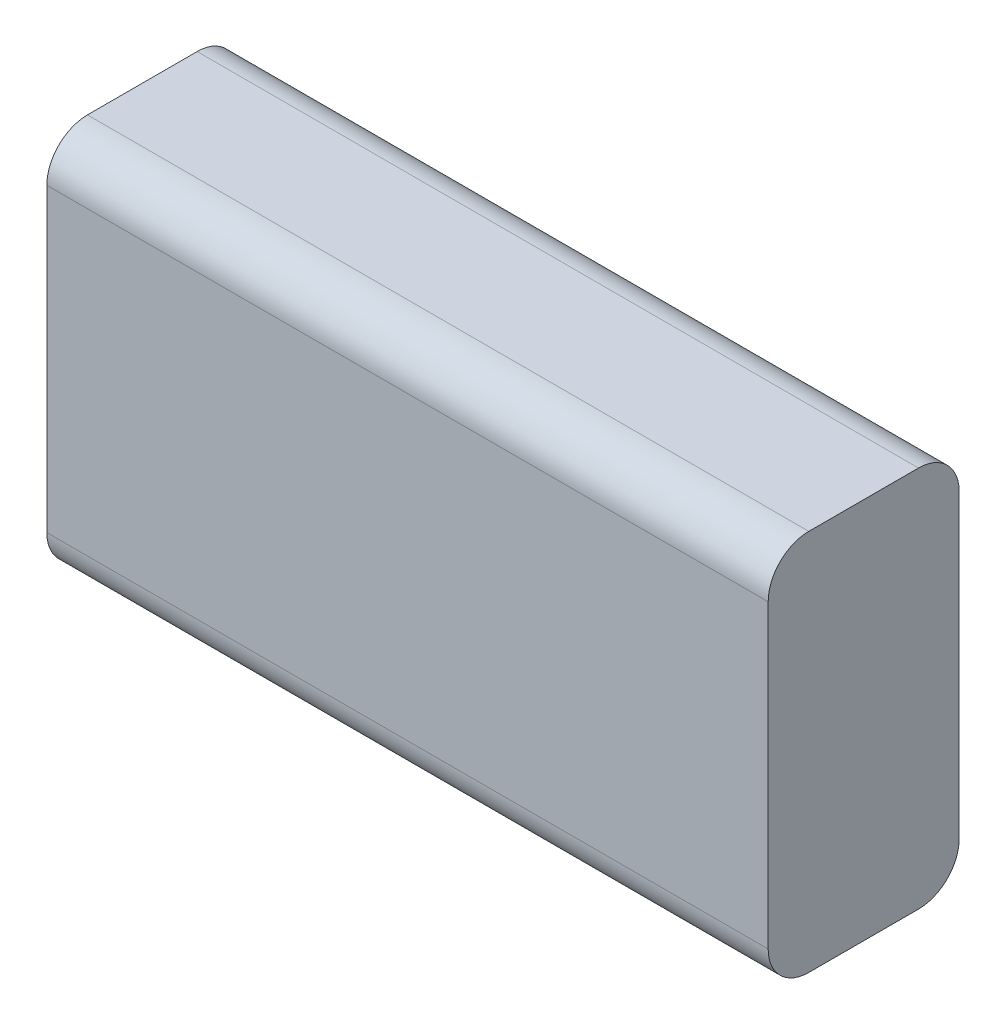
ISO-10303-21;
HEADER;
FILE_DESCRIPTION(('STEP AP214'),'2;1');
FILE_NAME('part.step','',(''),(''),'','','');
FILE_SCHEMA(('AUTOMOTIVE_DESIGN { 1 0 10303 214 1 1 1 1 }'));
ENDSEC;
DATA;
#1=APPLICATION_CONTEXT('core data for automotive mechanical design processes');
#2=APPLICATION_PROTOCOL_DEFINITION('international standard','automotive_design',2000,#1);
#3=PRODUCT_CONTEXT('',#1,'mechanical');
#4=PRODUCT('Part','Part','',(#3));
#5=PRODUCT_RELATED_PRODUCT_CATEGORY('part','',(#4));
#6=PRODUCT_DEFINITION_FORMATION('','',#4);
#7=PRODUCT_DEFINITION_CONTEXT('part definition',#1,'design');
#8=PRODUCT_DEFINITION('design','',#6,#7);
#9=PRODUCT_DEFINITION_SHAPE('','',#8);
#10=(LENGTH_UNIT() NAMED_UNIT(*) SI_UNIT(.MILLI.,.METRE.));
#11=(NAMED_UNIT(*) PLANE_ANGLE_UNIT() SI_UNIT($,.RADIAN.));
#12=(NAMED_UNIT(*) SI_UNIT($,.STERADIAN.) SOLID_ANGLE_UNIT());
#13=UNCERTAINTY_MEASURE_WITH_UNIT(LENGTH_MEASURE(1.E-05),#10,'distance_accuracy_value','');
#14=(GEOMETRIC_REPRESENTATION_CONTEXT(3) GLOBAL_UNCERTAINTY_ASSIGNED_CONTEXT((#13)) GLOBAL_UNIT_ASSIGNED_CONTEXT((#10,
#11,#12)) REPRESENTATION_CONTEXT('',''));
#15=CARTESIAN_POINT('',(0.,0.,0.));
#16=DIRECTION('',(0.,0.,1.));
#17=DIRECTION('',(1.,0.,0.));
#18=AXIS2_PLACEMENT_3D('',#15,#16,#17);
#19=CARTESIAN_POINT('',(27.9469853010806,-20.2775239107332,18.8));
#20=DIRECTION('',(-1.,0.,0.));
#21=DIRECTION('',(0.,0.,1.));
#22=AXIS2_PLACEMENT_3D('',#19,#20,#21);
#23=PLANE('',#22);
#24=DIRECTION('',(0.,0.,-1.));
#25=VECTOR('',#24,1.);
#26=CARTESIAN_POINT('',(27.9469853010806,-20.2775239107332,18.8));
#27=LINE('',#26,#25);
#28=CARTESIAN_POINT('',(27.9469853010806,-20.2775239107332,14.8));
#29=VERTEX_POINT('',#28);
#30=CARTESIAN_POINT('',(27.9469853010806,-20.2775239107332,4.));
#31=VERTEX_POINT('',#30);
#32=EDGE_CURVE('E150',#29,#31,#27,.T.);
#33=ORIENTED_EDGE('',*,*,#32,.T.);
#34=CARTESIAN_POINT('',(27.9469853010806,-16.2775239107332,4.));
#35=DIRECTION('',(-1.,0.,0.));
#36=DIRECTION('',(0.,0.,1.));
#37=AXIS2_PLACEMENT_3D('',#34,#35,#36);
#38=CIRCLE('',#37,4.);
#39=CARTESIAN_POINT('',(27.9469853010806,-16.2775239107332,0.));
#40=VERTEX_POINT('',#39);
#41=EDGE_CURVE('E52',#31,#40,#38,.F.);
#42=ORIENTED_EDGE('',*,*,#41,.T.);
#43=DIRECTION('',(0.,1.,0.));
#44=VECTOR('',#43,1.);
#45=CARTESIAN_POINT('',(27.9469853010806,-20.2775239107332,0.));
#46=LINE('',#45,#44);
#47=CARTESIAN_POINT('',(27.9469853010806,13.3224760892668,0.));
#48=VERTEX_POINT('',#47);
#49=EDGE_CURVE('E173',#40,#48,#46,.T.);
#50=ORIENTED_EDGE('',*,*,#49,.T.);
#51=CARTESIAN_POINT('',(27.9469853010806,13.3224760892668,4.));
#52=DIRECTION('',(-1.,0.,0.));
#53=DIRECTION('',(0.,0.,1.));
#54=AXIS2_PLACEMENT_3D('',#51,#52,#53);
#55=CIRCLE('',#54,4.);
#56=CARTESIAN_POINT('',(27.9469853010806,17.3224760892668,4.));
#57=VERTEX_POINT('',#56);
#58=EDGE_CURVE('E126',#48,#57,#55,.F.);
#59=ORIENTED_EDGE('',*,*,#58,.T.);
#60=DIRECTION('',(0.,0.,-1.));
#61=VECTOR('',#60,1.);
#62=CARTESIAN_POINT('',(27.9469853010806,17.3224760892668,18.8));
#63=LINE('',#62,#61);
#64=CARTESIAN_POINT('',(27.9469853010806,17.3224760892668,14.8));
#65=VERTEX_POINT('',#64);
#66=EDGE_CURVE('E111',#65,#57,#63,.T.);
#67=ORIENTED_EDGE('',*,*,#66,.F.);
#68=CARTESIAN_POINT('',(27.9469853010806,13.3224760892668,14.8));
#69=DIRECTION('',(-1.,0.,0.));
#70=DIRECTION('',(0.,0.,1.));
#71=AXIS2_PLACEMENT_3D('',#68,#69,#70);
#72=CIRCLE('',#71,4.);
#73=CARTESIAN_POINT('',(27.9469853010806,13.3224760892668,18.8));
#74=VERTEX_POINT('',#73);
#75=EDGE_CURVE('E109',#65,#74,#72,.F.);
#76=ORIENTED_EDGE('',*,*,#75,.T.);
#77=DIRECTION('',(0.,1.,0.));
#78=VECTOR('',#77,1.);
#79=CARTESIAN_POINT('',(27.9469853010806,-20.2775239107332,18.8));
#80=LINE('',#79,#78);
#81=CARTESIAN_POINT('',(27.9469853010806,-16.2775239107332,18.8));
#82=VERTEX_POINT('',#81);
#83=EDGE_CURVE('E95',#82,#74,#80,.T.);
#84=ORIENTED_EDGE('',*,*,#83,.F.);
#85=CARTESIAN_POINT('',(27.9469853010806,-16.2775239107332,14.8));
#86=DIRECTION('',(-1.,0.,0.));
#87=DIRECTION('',(0.,0.,1.));
#88=AXIS2_PLACEMENT_3D('',#85,#86,#87);
#89=CIRCLE('',#88,4.);
#90=EDGE_CURVE('E128',#82,#29,#89,.F.);
#91=ORIENTED_EDGE('',*,*,#90,.T.);
#92=EDGE_LOOP('',(#33,#42,#50,#59,#67,#76,#84,#91));
#93=FACE_BOUND('',#92,.T.);
#94=ADVANCED_FACE('F30',(#93),#23,.F.);
#95=CARTESIAN_POINT('',(27.9469853010806,17.3224760892668,18.8));
#96=DIRECTION('',(0.,-1.,0.));
#97=DIRECTION('',(1.,0.,0.));
#98=AXIS2_PLACEMENT_3D('',#95,#96,#97);
#99=PLANE('',#98);
#100=ORIENTED_EDGE('',*,*,#66,.T.);
#101=DIRECTION('',(-1.,0.,0.));
#102=VECTOR('',#101,1.);
#103=CARTESIAN_POINT('',(27.9469853010806,17.3224760892668,4.));
#104=LINE('',#103,#102);
#105=CARTESIAN_POINT('',(-43.0530146989194,17.3224760892668,4.));
#106=VERTEX_POINT('',#105);
#107=EDGE_CURVE('E136',#57,#106,#104,.T.);
#108=ORIENTED_EDGE('',*,*,#107,.T.);
#109=DIRECTION('',(0.,0.,-1.));
#110=VECTOR('',#109,1.);
#111=CARTESIAN_POINT('',(-43.0530146989194,17.3224760892668,18.8));
#112=LINE('',#111,#110);
#113=CARTESIAN_POINT('',(-43.0530146989194,17.3224760892668,14.8));
#114=VERTEX_POINT('',#113);
#115=EDGE_CURVE('E120',#114,#106,#112,.T.);
#116=ORIENTED_EDGE('',*,*,#115,.F.);
#117=DIRECTION('',(-1.,0.,0.));
#118=VECTOR('',#117,1.);
#119=CARTESIAN_POINT('',(27.9469853010806,17.3224760892668,14.8));
#120=LINE('',#119,#118);
#121=EDGE_CURVE('E114',#114,#65,#120,.F.);
#122=ORIENTED_EDGE('',*,*,#121,.T.);
#123=EDGE_LOOP('',(#100,#108,#116,#122));
#124=FACE_BOUND('',#123,.T.);
#125=ADVANCED_FACE('F166',(#124),#99,.F.);
#126=CARTESIAN_POINT('',(-43.0530146989194,-20.2775239107332,18.8));
#127=DIRECTION('',(1.,0.,0.));
#128=DIRECTION('',(0.,0.,-1.));
#129=AXIS2_PLACEMENT_3D('',#126,#127,#128);
#130=PLANE('',#129);
#131=DIRECTION('',(0.,-1.,0.));
#132=VECTOR('',#131,1.);
#133=CARTESIAN_POINT('',(-43.0530146989194,-20.2775239107332,0.));
#134=LINE('',#133,#132);
#135=CARTESIAN_POINT('',(-43.0530146989194,13.3224760892667,0.));
#136=VERTEX_POINT('',#135);
#137=CARTESIAN_POINT('',(-43.0530146989194,-16.2775239107332,0.));
#138=VERTEX_POINT('',#137);
#139=EDGE_CURVE('E105',#136,#138,#134,.T.);
#140=ORIENTED_EDGE('',*,*,#139,.T.);
#141=CARTESIAN_POINT('',(-43.0530146989194,-16.2775239107332,4.));
#142=DIRECTION('',(1.,0.,0.));
#143=DIRECTION('',(0.,0.,-1.));
#144=AXIS2_PLACEMENT_3D('',#141,#142,#143);
#145=CIRCLE('',#144,4.);
#146=CARTESIAN_POINT('',(-43.0530146989194,-20.2775239107332,4.));
#147=VERTEX_POINT('',#146);
#148=EDGE_CURVE('E11',#138,#147,#145,.F.);
#149=ORIENTED_EDGE('',*,*,#148,.T.);
#150=DIRECTION('',(0.,0.,-1.));
#151=VECTOR('',#150,1.);
#152=CARTESIAN_POINT('',(-43.0530146989194,-20.2775239107332,18.8));
#153=LINE('',#152,#151);
#154=CARTESIAN_POINT('',(-43.0530146989194,-20.2775239107332,14.8));
#155=VERTEX_POINT('',#154);
#156=EDGE_CURVE('E153',#155,#147,#153,.T.);
#157=ORIENTED_EDGE('',*,*,#156,.F.);
#158=CARTESIAN_POINT('',(-43.0530146989194,-16.2775239107332,14.8));
#159=DIRECTION('',(1.,0.,0.));
#160=DIRECTION('',(0.,0.,-1.));
#161=AXIS2_PLACEMENT_3D('',#158,#159,#160);
#162=CIRCLE('',#161,4.);
#163=CARTESIAN_POINT('',(-43.0530146989194,-16.2775239107332,18.8));
#164=VERTEX_POINT('',#163);
#165=EDGE_CURVE('E134',#155,#164,#162,.F.);
#166=ORIENTED_EDGE('',*,*,#165,.T.);
#167=DIRECTION('',(0.,-1.,0.));
#168=VECTOR('',#167,1.);
#169=CARTESIAN_POINT('',(-43.0530146989194,-20.2775239107332,18.8));
#170=LINE('',#169,#168);
#171=CARTESIAN_POINT('',(-43.0530146989194,13.3224760892667,18.8));
#172=VERTEX_POINT('',#171);
#173=EDGE_CURVE('E104',#172,#164,#170,.T.);
#174=ORIENTED_EDGE('',*,*,#173,.F.);
#175=CARTESIAN_POINT('',(-43.0530146989194,13.3224760892668,14.8));
#176=DIRECTION('',(1.,0.,0.));
#177=DIRECTION('',(0.,0.,-1.));
#178=AXIS2_PLACEMENT_3D('',#175,#176,#177);
#179=CIRCLE('',#178,4.);
#180=EDGE_CURVE('E117',#172,#114,#179,.F.);
#181=ORIENTED_EDGE('',*,*,#180,.T.);
#182=ORIENTED_EDGE('',*,*,#115,.T.);
#183=CARTESIAN_POINT('',(-43.0530146989194,13.3224760892668,4.));
#184=DIRECTION('',(1.,0.,0.));
#185=DIRECTION('',(0.,0.,-1.));
#186=AXIS2_PLACEMENT_3D('',#183,#184,#185);
#187=CIRCLE('',#186,4.);
#188=EDGE_CURVE('E132',#106,#136,#187,.F.);
#189=ORIENTED_EDGE('',*,*,#188,.T.);
#190=EDGE_LOOP('',(#140,#149,#157,#166,#174,#181,#182,#189));
#191=FACE_BOUND('',#190,.T.);
#192=ADVANCED_FACE('F164',(#191),#130,.F.);
#193=CARTESIAN_POINT('',(27.9469853010806,-20.2775239107332,18.8));
#194=DIRECTION('',(0.,1.,0.));
#195=DIRECTION('',(-1.,0.,0.));
#196=AXIS2_PLACEMENT_3D('',#193,#194,#195);
#197=PLANE('',#196);
#198=ORIENTED_EDGE('',*,*,#156,.T.);
#199=DIRECTION('',(1.,0.,0.));
#200=VECTOR('',#199,1.);
#201=CARTESIAN_POINT('',(27.9469853010806,-20.2775239107332,4.));
#202=LINE('',#201,#200);
#203=EDGE_CURVE('E142',#147,#31,#202,.T.);
#204=ORIENTED_EDGE('',*,*,#203,.T.);
#205=ORIENTED_EDGE('',*,*,#32,.F.);
#206=DIRECTION('',(1.,0.,0.));
#207=VECTOR('',#206,1.);
#208=CARTESIAN_POINT('',(-43.0530146989194,-20.2775239107332,14.8));
#209=LINE('',#208,#207);
#210=EDGE_CURVE('E130',#29,#155,#209,.F.);
#211=ORIENTED_EDGE('',*,*,#210,.T.);
#212=EDGE_LOOP('',(#198,#204,#205,#211));
#213=FACE_BOUND('',#212,.T.);
#214=ADVANCED_FACE('F149',(#213),#197,.F.);
#215=CARTESIAN_POINT('',(27.9469853010806,17.3224760892668,18.8));
#216=DIRECTION('',(0.,0.,1.));
#217=DIRECTION('',(1.,0.,0.));
#218=AXIS2_PLACEMENT_3D('',#215,#216,#217);
#219=PLANE('',#218);
#220=ORIENTED_EDGE('',*,*,#173,.T.);
#221=DIRECTION('',(1.,0.,0.));
#222=VECTOR('',#221,1.);
#223=CARTESIAN_POINT('',(27.9469853010806,-16.2775239107332,18.8));
#224=LINE('',#223,#222);
#225=EDGE_CURVE('E103',#164,#82,#224,.T.);
#226=ORIENTED_EDGE('',*,*,#225,.T.);
#227=ORIENTED_EDGE('',*,*,#83,.T.);
#228=DIRECTION('',(-1.,0.,0.));
#229=VECTOR('',#228,1.);
#230=CARTESIAN_POINT('',(-43.0530146989194,13.3224760892668,18.8));
#231=LINE('',#230,#229);
#232=EDGE_CURVE('E100',#74,#172,#231,.T.);
#233=ORIENTED_EDGE('',*,*,#232,.T.);
#234=EDGE_LOOP('',(#220,#226,#227,#233));
#235=FACE_BOUND('',#234,.T.);
#236=ADVANCED_FACE('F98',(#235),#219,.T.);
#237=CARTESIAN_POINT('',(27.9469853010806,17.3224760892668,0.));
#238=DIRECTION('',(0.,0.,1.));
#239=DIRECTION('',(1.,0.,0.));
#240=AXIS2_PLACEMENT_3D('',#237,#238,#239);
#241=PLANE('',#240);
#242=ORIENTED_EDGE('',*,*,#49,.F.);
#243=DIRECTION('',(1.,0.,0.));
#244=VECTOR('',#243,1.);
#245=CARTESIAN_POINT('',(27.9469853010806,-16.2775239107332,0.));
#246=LINE('',#245,#244);
#247=EDGE_CURVE('E38',#40,#138,#246,.F.);
#248=ORIENTED_EDGE('',*,*,#247,.T.);
#249=ORIENTED_EDGE('',*,*,#139,.F.);
#250=DIRECTION('',(-1.,0.,0.));
#251=VECTOR('',#250,1.);
#252=CARTESIAN_POINT('',(27.9469853010806,13.3224760892668,0.));
#253=LINE('',#252,#251);
#254=EDGE_CURVE('E139',#136,#48,#253,.F.);
#255=ORIENTED_EDGE('',*,*,#254,.T.);
#256=EDGE_LOOP('',(#242,#248,#249,#255));
#257=FACE_BOUND('',#256,.T.);
#258=ADVANCED_FACE('F172',(#257),#241,.F.);
#259=CARTESIAN_POINT('',(27.9469853010806,13.3224760892668,14.8));
#260=DIRECTION('',(1.,0.,0.));
#261=DIRECTION('',(0.,1.,0.));
#262=AXIS2_PLACEMENT_3D('',#259,#260,#261);
#263=CYLINDRICAL_SURFACE('',#262,4.);
#264=ORIENTED_EDGE('',*,*,#75,.F.);
#265=ORIENTED_EDGE('',*,*,#121,.F.);
#266=ORIENTED_EDGE('',*,*,#180,.F.);
#267=ORIENTED_EDGE('',*,*,#232,.F.);
#268=EDGE_LOOP('',(#264,#265,#266,#267));
#269=FACE_BOUND('',#268,.T.);
#270=ADVANCED_FACE('F116',(#269),#263,.T.);
#271=CARTESIAN_POINT('',(27.9469853010806,-16.2775239107332,14.8));
#272=DIRECTION('',(-1.,0.,0.));
#273=DIRECTION('',(0.,-1.,0.));
#274=AXIS2_PLACEMENT_3D('',#271,#272,#273);
#275=CYLINDRICAL_SURFACE('',#274,4.);
#276=ORIENTED_EDGE('',*,*,#165,.F.);
#277=ORIENTED_EDGE('',*,*,#210,.F.);
#278=ORIENTED_EDGE('',*,*,#90,.F.);
#279=ORIENTED_EDGE('',*,*,#225,.F.);
#280=EDGE_LOOP('',(#276,#277,#278,#279));
#281=FACE_BOUND('',#280,.T.);
#282=ADVANCED_FACE('F178',(#281),#275,.T.);
#283=CARTESIAN_POINT('',(27.9469853010806,13.3224760892668,4.));
#284=DIRECTION('',(-1.,0.,0.));
#285=DIRECTION('',(0.,-1.,0.));
#286=AXIS2_PLACEMENT_3D('',#283,#284,#285);
#287=CYLINDRICAL_SURFACE('',#286,4.);
#288=ORIENTED_EDGE('',*,*,#58,.F.);
#289=ORIENTED_EDGE('',*,*,#254,.F.);
#290=ORIENTED_EDGE('',*,*,#188,.F.);
#291=ORIENTED_EDGE('',*,*,#107,.F.);
#292=EDGE_LOOP('',(#288,#289,#290,#291));
#293=FACE_BOUND('',#292,.T.);
#294=ADVANCED_FACE('F170',(#293),#287,.T.);
#295=CARTESIAN_POINT('',(27.9469853010806,-16.2775239107332,4.));
#296=DIRECTION('',(1.,0.,0.));
#297=DIRECTION('',(0.,1.,0.));
#298=AXIS2_PLACEMENT_3D('',#295,#296,#297);
#299=CYLINDRICAL_SURFACE('',#298,4.);
#300=ORIENTED_EDGE('',*,*,#148,.F.);
#301=ORIENTED_EDGE('',*,*,#247,.F.);
#302=ORIENTED_EDGE('',*,*,#41,.F.);
#303=ORIENTED_EDGE('',*,*,#203,.F.);
#304=EDGE_LOOP('',(#300,#301,#302,#303));
#305=FACE_BOUND('',#304,.T.);
#306=ADVANCED_FACE('F32',(#305),#299,.T.);
#307=CLOSED_SHELL('',(#94,#125,#192,#214,#236,#258,#270,#282,#294,#306));
#308=MANIFOLD_SOLID_BREP('B2',#307);
#309=ADVANCED_BREP_SHAPE_REPRESENTATION('',(#18,#308),#14);
#310=SHAPE_DEFINITION_REPRESENTATION(#9,#309);
ENDSEC;
END-ISO-10303-21;
